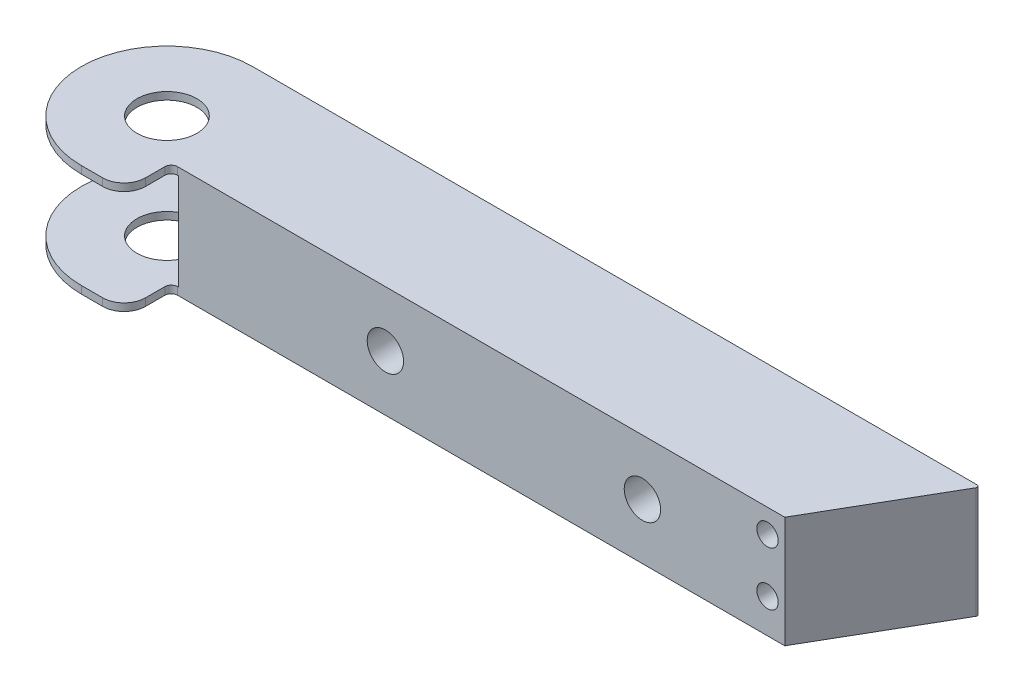
ISO-10303-21;
HEADER;
FILE_DESCRIPTION(('STEP AP214'),'2;1');
FILE_NAME('part.step','',(''),(''),'','','');
FILE_SCHEMA(('AUTOMOTIVE_DESIGN { 1 0 10303 214 1 1 1 1 }'));
ENDSEC;
DATA;
#1=APPLICATION_CONTEXT('core data for automotive mechanical design processes');
#2=APPLICATION_PROTOCOL_DEFINITION('international standard','automotive_design',2000,#1);
#3=PRODUCT_CONTEXT('',#1,'mechanical');
#4=PRODUCT('Part','Part','',(#3));
#5=PRODUCT_RELATED_PRODUCT_CATEGORY('part','',(#4));
#6=PRODUCT_DEFINITION_FORMATION('','',#4);
#7=PRODUCT_DEFINITION_CONTEXT('part definition',#1,'design');
#8=PRODUCT_DEFINITION('design','',#6,#7);
#9=PRODUCT_DEFINITION_SHAPE('','',#8);
#10=(LENGTH_UNIT() NAMED_UNIT(*) SI_UNIT(.MILLI.,.METRE.));
#11=(NAMED_UNIT(*) PLANE_ANGLE_UNIT() SI_UNIT($,.RADIAN.));
#12=(NAMED_UNIT(*) SI_UNIT($,.STERADIAN.) SOLID_ANGLE_UNIT());
#13=UNCERTAINTY_MEASURE_WITH_UNIT(LENGTH_MEASURE(1.E-05),#10,'distance_accuracy_value','');
#14=(GEOMETRIC_REPRESENTATION_CONTEXT(3) GLOBAL_UNCERTAINTY_ASSIGNED_CONTEXT((#13)) GLOBAL_UNIT_ASSIGNED_CONTEXT((#10,
#11,#12)) REPRESENTATION_CONTEXT('',''));
#15=CARTESIAN_POINT('',(0.,0.,0.));
#16=DIRECTION('',(0.,0.,1.));
#17=DIRECTION('',(1.,0.,0.));
#18=AXIS2_PLACEMENT_3D('',#15,#16,#17);
#19=CARTESIAN_POINT('',(4.,5.5,4.));
#20=DIRECTION('',(0.,-1.,0.));
#21=DIRECTION('',(0.,0.,-1.));
#22=AXIS2_PLACEMENT_3D('',#19,#20,#21);
#23=CYLINDRICAL_SURFACE('',#22,4.);
#24=DIRECTION('',(0.,-1.,0.));
#25=VECTOR('',#24,1.);
#26=CARTESIAN_POINT('',(4.,5.5,0.));
#27=LINE('',#26,#25);
#28=CARTESIAN_POINT('',(4.,5.,0.));
#29=VERTEX_POINT('',#28);
#30=CARTESIAN_POINT('',(4.,5.35,0.));
#31=VERTEX_POINT('',#30);
#32=EDGE_CURVE('E210',#29,#31,#27,.F.);
#33=ORIENTED_EDGE('',*,*,#32,.F.);
#34=CARTESIAN_POINT('',(4.,5.,4.));
#35=DIRECTION('',(0.,-1.,0.));
#36=DIRECTION('',(1.,0.,0.));
#37=AXIS2_PLACEMENT_3D('',#34,#35,#36);
#38=CIRCLE('',#37,4.);
#39=CARTESIAN_POINT('',(0.,5.,4.));
#40=VERTEX_POINT('',#39);
#41=EDGE_CURVE('E186',#29,#40,#38,.F.);
#42=ORIENTED_EDGE('',*,*,#41,.T.);
#43=DIRECTION('',(0.,-1.,0.));
#44=VECTOR('',#43,1.);
#45=CARTESIAN_POINT('',(0.,5.5,4.));
#46=LINE('',#45,#44);
#47=CARTESIAN_POINT('',(0.,5.35,4.));
#48=VERTEX_POINT('',#47);
#49=EDGE_CURVE('E219',#48,#40,#46,.T.);
#50=ORIENTED_EDGE('',*,*,#49,.F.);
#51=CARTESIAN_POINT('',(4.,5.35,4.));
#52=DIRECTION('',(0.,1.,0.));
#53=DIRECTION('',(0.,0.,1.));
#54=AXIS2_PLACEMENT_3D('',#51,#52,#53);
#55=CIRCLE('',#54,4.);
#56=EDGE_CURVE('E312',#48,#31,#55,.F.);
#57=ORIENTED_EDGE('',*,*,#56,.T.);
#58=EDGE_LOOP('',(#33,#42,#50,#57));
#59=FACE_BOUND('',#58,.T.);
#60=ADVANCED_FACE('F37',(#59),#23,.T.);
#61=CARTESIAN_POINT('',(4.,5.5,4.));
#62=DIRECTION('',(0.,-1.,0.));
#63=DIRECTION('',(0.,0.,-1.));
#64=AXIS2_PLACEMENT_3D('',#61,#62,#63);
#65=CYLINDRICAL_SURFACE('',#64,4.);
#66=ORIENTED_EDGE('',*,*,#49,.T.);
#67=CARTESIAN_POINT('',(4.,5.,4.));
#68=DIRECTION('',(0.,1.,0.));
#69=DIRECTION('',(-1.,0.,0.));
#70=AXIS2_PLACEMENT_3D('',#67,#68,#69);
#71=CIRCLE('',#70,4.);
#72=CARTESIAN_POINT('',(4.,5.,8.));
#73=VERTEX_POINT('',#72);
#74=EDGE_CURVE('E215',#73,#40,#71,.F.);
#75=ORIENTED_EDGE('',*,*,#74,.F.);
#76=DIRECTION('',(0.,-1.,0.));
#77=VECTOR('',#76,1.);
#78=CARTESIAN_POINT('',(4.,5.5,8.));
#79=LINE('',#78,#77);
#80=CARTESIAN_POINT('',(4.,5.35,8.));
#81=VERTEX_POINT('',#80);
#82=EDGE_CURVE('E372',#81,#73,#79,.T.);
#83=ORIENTED_EDGE('',*,*,#82,.F.);
#84=CARTESIAN_POINT('',(4.,5.35,4.));
#85=DIRECTION('',(0.,1.,0.));
#86=DIRECTION('',(0.,0.,1.));
#87=AXIS2_PLACEMENT_3D('',#84,#85,#86);
#88=CIRCLE('',#87,4.);
#89=EDGE_CURVE('E320',#81,#48,#88,.F.);
#90=ORIENTED_EDGE('',*,*,#89,.T.);
#91=EDGE_LOOP('',(#66,#75,#83,#90));
#92=FACE_BOUND('',#91,.T.);
#93=ADVANCED_FACE('F385',(#92),#65,.T.);
#94=CARTESIAN_POINT('',(4.,5.,4.));
#95=DIRECTION('',(0.,-1.,0.));
#96=DIRECTION('',(1.,0.,0.));
#97=AXIS2_PLACEMENT_3D('',#94,#95,#96);
#98=CYLINDRICAL_SURFACE('',#97,2.4);
#99=CARTESIAN_POINT('',(4.,5.,4.));
#100=DIRECTION('',(0.,1.,0.));
#101=DIRECTION('',(-1.,0.,0.));
#102=AXIS2_PLACEMENT_3D('',#99,#100,#101);
#103=CIRCLE('',#102,2.4);
#104=CARTESIAN_POINT('',(6.3473389188611,5.,4.5));
#105=VERTEX_POINT('',#104);
#106=CARTESIAN_POINT('',(4.,5.,1.6));
#107=VERTEX_POINT('',#106);
#108=EDGE_CURVE('E347',#105,#107,#103,.T.);
#109=ORIENTED_EDGE('',*,*,#108,.T.);
#110=DIRECTION('',(0.,-1.,0.));
#111=VECTOR('',#110,1.);
#112=CARTESIAN_POINT('',(4.,5.,1.6));
#113=LINE('',#112,#111);
#114=CARTESIAN_POINT('',(4.,0.5,1.6));
#115=VERTEX_POINT('',#114);
#116=EDGE_CURVE('E11',#107,#115,#113,.T.);
#117=ORIENTED_EDGE('',*,*,#116,.T.);
#118=CARTESIAN_POINT('',(4.,0.5,4.));
#119=DIRECTION('',(0.,1.,0.));
#120=DIRECTION('',(-1.,0.,0.));
#121=AXIS2_PLACEMENT_3D('',#118,#119,#120);
#122=CIRCLE('',#121,2.4);
#123=CARTESIAN_POINT('',(6.3473389188611,0.5,4.5));
#124=VERTEX_POINT('',#123);
#125=EDGE_CURVE('E196',#124,#115,#122,.T.);
#126=ORIENTED_EDGE('',*,*,#125,.F.);
#127=DIRECTION('',(0.,-1.,0.));
#128=VECTOR('',#127,1.);
#129=CARTESIAN_POINT('',(6.3473389188611,5.,4.5));
#130=LINE('',#129,#128);
#131=EDGE_CURVE('E350',#105,#124,#130,.T.);
#132=ORIENTED_EDGE('',*,*,#131,.F.);
#133=EDGE_LOOP('',(#109,#117,#126,#132));
#134=FACE_BOUND('',#133,.T.);
#135=ADVANCED_FACE('F446',(#134),#98,.F.);
#136=CARTESIAN_POINT('',(30.,5.5,8.));
#137=DIRECTION('',(0.,0.,-1.));
#138=DIRECTION('',(-1.,0.,0.));
#139=AXIS2_PLACEMENT_3D('',#136,#137,#138);
#140=PLANE('',#139);
#141=DIRECTION('',(1.,0.,0.));
#142=VECTOR('',#141,1.);
#143=CARTESIAN_POINT('',(30.,5.35,8.));
#144=LINE('',#143,#142);
#145=CARTESIAN_POINT('',(5.,5.35,8.));
#146=VERTEX_POINT('',#145);
#147=EDGE_CURVE('E323',#81,#146,#144,.T.);
#148=ORIENTED_EDGE('',*,*,#147,.F.);
#149=ORIENTED_EDGE('',*,*,#82,.T.);
#150=DIRECTION('',(-1.,0.,0.));
#151=VECTOR('',#150,1.);
#152=CARTESIAN_POINT('',(6.,5.,8.));
#153=LINE('',#152,#151);
#154=CARTESIAN_POINT('',(5.,5.,8.));
#155=VERTEX_POINT('',#154);
#156=EDGE_CURVE('E359',#155,#73,#153,.T.);
#157=ORIENTED_EDGE('',*,*,#156,.F.);
#158=DIRECTION('',(0.,-1.,0.));
#159=VECTOR('',#158,1.);
#160=CARTESIAN_POINT('',(5.,5.5,8.));
#161=LINE('',#160,#159);
#162=EDGE_CURVE('E247',#155,#146,#161,.F.);
#163=ORIENTED_EDGE('',*,*,#162,.T.);
#164=EDGE_LOOP('',(#148,#149,#157,#163));
#165=FACE_BOUND('',#164,.T.);
#166=ADVANCED_FACE('F389',(#165),#140,.F.);
#167=CARTESIAN_POINT('',(0.,5.5,0.));
#168=DIRECTION('',(0.,0.,1.));
#169=DIRECTION('',(1.,0.,0.));
#170=AXIS2_PLACEMENT_3D('',#167,#168,#169);
#171=PLANE('',#170);
#172=CARTESIAN_POINT('',(16.,2.75,0.));
#173=DIRECTION('',(0.,0.,-1.));
#174=DIRECTION('',(-1.,0.,0.));
#175=AXIS2_PLACEMENT_3D('',#172,#173,#174);
#176=CIRCLE('',#175,0.84999999999999);
#177=CARTESIAN_POINT('',(15.15,2.75,0.));
#178=VERTEX_POINT('',#177);
#179=EDGE_CURVE('E185',#178,#178,#176,.T.);
#180=ORIENTED_EDGE('',*,*,#179,.F.);
#181=EDGE_LOOP('',(#180));
#182=FACE_BOUND('',#181,.T.);
#183=CARTESIAN_POINT('',(28.,2.75,0.));
#184=DIRECTION('',(0.,0.,-1.));
#185=DIRECTION('',(-1.,0.,0.));
#186=AXIS2_PLACEMENT_3D('',#183,#184,#185);
#187=CIRCLE('',#186,0.849999999999986);
#188=CARTESIAN_POINT('',(27.15,2.75,0.));
#189=VERTEX_POINT('',#188);
#190=EDGE_CURVE('E266',#189,#189,#187,.T.);
#191=ORIENTED_EDGE('',*,*,#190,.F.);
#192=EDGE_LOOP('',(#191));
#193=FACE_BOUND('',#192,.T.);
#194=CARTESIAN_POINT('',(33.84,1.75,0.));
#195=DIRECTION('',(0.,0.,-1.));
#196=DIRECTION('',(-1.,0.,0.));
#197=AXIS2_PLACEMENT_3D('',#194,#195,#196);
#198=CIRCLE('',#197,0.499999999999999);
#199=CARTESIAN_POINT('',(33.34,1.75,0.));
#200=VERTEX_POINT('',#199);
#201=EDGE_CURVE('E328',#200,#200,#198,.T.);
#202=ORIENTED_EDGE('',*,*,#201,.F.);
#203=EDGE_LOOP('',(#202));
#204=FACE_BOUND('',#203,.T.);
#205=CARTESIAN_POINT('',(33.84,4.25,0.));
#206=DIRECTION('',(0.,0.,-1.));
#207=DIRECTION('',(-1.,0.,0.));
#208=AXIS2_PLACEMENT_3D('',#205,#206,#207);
#209=CIRCLE('',#208,0.499999999999999);
#210=CARTESIAN_POINT('',(33.34,4.25,0.));
#211=VERTEX_POINT('',#210);
#212=EDGE_CURVE('E255',#211,#211,#209,.T.);
#213=ORIENTED_EDGE('',*,*,#212,.F.);
#214=EDGE_LOOP('',(#213));
#215=FACE_BOUND('',#214,.T.);
#216=DIRECTION('',(0.,-1.,0.));
#217=VECTOR('',#216,1.);
#218=CARTESIAN_POINT('',(37.8266613534235,0.,0.));
#219=LINE('',#218,#217);
#220=CARTESIAN_POINT('',(37.8266613534235,5.35,0.));
#221=VERTEX_POINT('',#220);
#222=CARTESIAN_POINT('',(37.8266613534235,0.15,0.));
#223=VERTEX_POINT('',#222);
#224=EDGE_CURVE('E250',#221,#223,#219,.T.);
#225=ORIENTED_EDGE('',*,*,#224,.T.);
#226=DIRECTION('',(-1.,0.,0.));
#227=VECTOR('',#226,1.);
#228=CARTESIAN_POINT('',(0.,0.15,0.));
#229=LINE('',#228,#227);
#230=CARTESIAN_POINT('',(4.,0.15,0.));
#231=VERTEX_POINT('',#230);
#232=EDGE_CURVE('E208',#223,#231,#229,.T.);
#233=ORIENTED_EDGE('',*,*,#232,.T.);
#234=CARTESIAN_POINT('',(4.,0.5,0.));
#235=VERTEX_POINT('',#234);
#236=EDGE_CURVE('E202',#231,#235,#27,.F.);
#237=ORIENTED_EDGE('',*,*,#236,.T.);
#238=DIRECTION('',(0.,-1.,0.));
#239=VECTOR('',#238,1.);
#240=CARTESIAN_POINT('',(4.,5.5,0.));
#241=LINE('',#240,#239);
#242=EDGE_CURVE('E176',#235,#29,#241,.F.);
#243=ORIENTED_EDGE('',*,*,#242,.T.);
#244=ORIENTED_EDGE('',*,*,#32,.T.);
#245=DIRECTION('',(-1.,0.,0.));
#246=VECTOR('',#245,1.);
#247=CARTESIAN_POINT('',(0.,5.35,0.));
#248=LINE('',#247,#246);
#249=EDGE_CURVE('E307',#221,#31,#248,.T.);
#250=ORIENTED_EDGE('',*,*,#249,.F.);
#251=EDGE_LOOP('',(#225,#233,#237,#243,#244,#250));
#252=FACE_BOUND('',#251,.T.);
#253=ADVANCED_FACE('F207',(#182,#193,#204,#215,#252),#171,.F.);
#254=CARTESIAN_POINT('',(6.,5.5,4.5));
#255=DIRECTION('',(-1.,0.,0.));
#256=DIRECTION('',(0.,0.,1.));
#257=AXIS2_PLACEMENT_3D('',#254,#255,#256);
#258=PLANE('',#257);
#259=DIRECTION('',(0.,0.,-1.));
#260=VECTOR('',#259,1.);
#261=CARTESIAN_POINT('',(6.,5.35,4.5));
#262=LINE('',#261,#260);
#263=CARTESIAN_POINT('',(6.,5.35,7.));
#264=VERTEX_POINT('',#263);
#265=CARTESIAN_POINT('',(6.,5.35,6.1));
#266=VERTEX_POINT('',#265);
#267=EDGE_CURVE('E315',#264,#266,#262,.T.);
#268=ORIENTED_EDGE('',*,*,#267,.F.);
#269=DIRECTION('',(0.,-1.,0.));
#270=VECTOR('',#269,1.);
#271=CARTESIAN_POINT('',(6.,5.5,7.));
#272=LINE('',#271,#270);
#273=CARTESIAN_POINT('',(6.,5.,7.));
#274=VERTEX_POINT('',#273);
#275=EDGE_CURVE('E243',#264,#274,#272,.T.);
#276=ORIENTED_EDGE('',*,*,#275,.T.);
#277=DIRECTION('',(0.,0.,1.));
#278=VECTOR('',#277,1.);
#279=CARTESIAN_POINT('',(6.,5.,4.5));
#280=LINE('',#279,#278);
#281=CARTESIAN_POINT('',(6.,5.,6.1));
#282=VERTEX_POINT('',#281);
#283=EDGE_CURVE('E363',#282,#274,#280,.T.);
#284=ORIENTED_EDGE('',*,*,#283,.F.);
#285=DIRECTION('',(0.,-1.,0.));
#286=VECTOR('',#285,1.);
#287=CARTESIAN_POINT('',(6.,5.5,6.1));
#288=LINE('',#287,#286);
#289=EDGE_CURVE('E229',#282,#266,#288,.F.);
#290=ORIENTED_EDGE('',*,*,#289,.T.);
#291=EDGE_LOOP('',(#268,#276,#284,#290));
#292=FACE_BOUND('',#291,.T.);
#293=ADVANCED_FACE('F398',(#292),#258,.F.);
#294=CARTESIAN_POINT('',(4.,0.5,4.));
#295=DIRECTION('',(0.,-1.,0.));
#296=DIRECTION('',(1.,0.,0.));
#297=AXIS2_PLACEMENT_3D('',#294,#295,#296);
#298=CIRCLE('',#297,4.);
#299=CARTESIAN_POINT('',(0.,0.499999999999999,4.));
#300=VERTEX_POINT('',#299);
#301=EDGE_CURVE('E193',#235,#300,#298,.F.);
#302=ORIENTED_EDGE('',*,*,#301,.F.);
#303=ORIENTED_EDGE('',*,*,#236,.F.);
#304=CARTESIAN_POINT('',(4.,0.15,4.));
#305=DIRECTION('',(0.,1.,0.));
#306=DIRECTION('',(0.,0.,1.));
#307=AXIS2_PLACEMENT_3D('',#304,#305,#306);
#308=CIRCLE('',#307,4.);
#309=CARTESIAN_POINT('',(0.,0.15,4.));
#310=VERTEX_POINT('',#309);
#311=EDGE_CURVE('E287',#310,#231,#308,.F.);
#312=ORIENTED_EDGE('',*,*,#311,.F.);
#313=EDGE_CURVE('E203',#300,#310,#46,.T.);
#314=ORIENTED_EDGE('',*,*,#313,.F.);
#315=EDGE_LOOP('',(#302,#303,#312,#314));
#316=FACE_BOUND('',#315,.T.);
#317=ADVANCED_FACE('F200',(#316),#23,.T.);
#318=CARTESIAN_POINT('',(4.,0.5,4.));
#319=DIRECTION('',(0.,-1.,0.));
#320=DIRECTION('',(1.,0.,0.));
#321=AXIS2_PLACEMENT_3D('',#318,#319,#320);
#322=CIRCLE('',#321,4.);
#323=CARTESIAN_POINT('',(4.,0.5,8.));
#324=VERTEX_POINT('',#323);
#325=EDGE_CURVE('E371',#300,#324,#322,.F.);
#326=ORIENTED_EDGE('',*,*,#325,.F.);
#327=ORIENTED_EDGE('',*,*,#313,.T.);
#328=CARTESIAN_POINT('',(4.,0.15,4.));
#329=DIRECTION('',(0.,1.,0.));
#330=DIRECTION('',(0.,0.,1.));
#331=AXIS2_PLACEMENT_3D('',#328,#329,#330);
#332=CIRCLE('',#331,4.);
#333=CARTESIAN_POINT('',(4.,0.15,8.));
#334=VERTEX_POINT('',#333);
#335=EDGE_CURVE('E284',#334,#310,#332,.F.);
#336=ORIENTED_EDGE('',*,*,#335,.F.);
#337=DIRECTION('',(0.,-1.,0.));
#338=VECTOR('',#337,1.);
#339=CARTESIAN_POINT('',(4.,5.5,8.));
#340=LINE('',#339,#338);
#341=EDGE_CURVE('E366',#324,#334,#340,.T.);
#342=ORIENTED_EDGE('',*,*,#341,.F.);
#343=EDGE_LOOP('',(#326,#327,#336,#342));
#344=FACE_BOUND('',#343,.T.);
#345=ADVANCED_FACE('F422',(#344),#65,.T.);
#346=CARTESIAN_POINT('',(4.,-0.8,4.));
#347=DIRECTION('',(0.,1.,0.));
#348=DIRECTION('',(0.,0.,1.));
#349=AXIS2_PLACEMENT_3D('',#346,#347,#348);
#350=CYLINDRICAL_SURFACE('',#349,1.4);
#351=CARTESIAN_POINT('',(4.,5.,4.));
#352=DIRECTION('',(0.,1.,0.));
#353=DIRECTION('',(-1.,0.,0.));
#354=AXIS2_PLACEMENT_3D('',#351,#352,#353);
#355=CIRCLE('',#354,1.4);
#356=CARTESIAN_POINT('',(2.6,5.,4.));
#357=VERTEX_POINT('',#356);
#358=EDGE_CURVE('E354',#357,#357,#355,.T.);
#359=ORIENTED_EDGE('',*,*,#358,.F.);
#360=EDGE_LOOP('',(#359));
#361=FACE_BOUND('',#360,.T.);
#362=CARTESIAN_POINT('',(4.,5.35,4.));
#363=DIRECTION('',(0.,1.,0.));
#364=DIRECTION('',(0.,0.,1.));
#365=AXIS2_PLACEMENT_3D('',#362,#363,#364);
#366=CIRCLE('',#365,1.4);
#367=CARTESIAN_POINT('',(4.,5.35,5.4));
#368=VERTEX_POINT('',#367);
#369=EDGE_CURVE('E325',#368,#368,#366,.F.);
#370=ORIENTED_EDGE('',*,*,#369,.F.);
#371=EDGE_LOOP('',(#370));
#372=FACE_BOUND('',#371,.T.);
#373=ADVANCED_FACE('F468',(#361,#372),#350,.F.);
#374=CARTESIAN_POINT('',(0.,0.,5.8));
#375=DIRECTION('',(0.,0.,1.));
#376=DIRECTION('',(1.,0.,0.));
#377=AXIS2_PLACEMENT_3D('',#374,#375,#376);
#378=PLANE('',#377);
#379=CARTESIAN_POINT('',(16.,2.75,5.8));
#380=DIRECTION('',(0.,0.,1.));
#381=DIRECTION('',(1.,0.,0.));
#382=AXIS2_PLACEMENT_3D('',#379,#380,#381);
#383=CIRCLE('',#382,0.849999999999988);
#384=CARTESIAN_POINT('',(16.85,2.75,5.8));
#385=VERTEX_POINT('',#384);
#386=EDGE_CURVE('E264',#385,#385,#383,.T.);
#387=ORIENTED_EDGE('',*,*,#386,.F.);
#388=EDGE_LOOP('',(#387));
#389=FACE_BOUND('',#388,.T.);
#390=CARTESIAN_POINT('',(28.,2.75,5.8));
#391=DIRECTION('',(0.,0.,1.));
#392=DIRECTION('',(1.,0.,0.));
#393=AXIS2_PLACEMENT_3D('',#390,#391,#392);
#394=CIRCLE('',#393,0.849999999999986);
#395=CARTESIAN_POINT('',(28.85,2.75,5.8));
#396=VERTEX_POINT('',#395);
#397=EDGE_CURVE('E270',#396,#396,#394,.T.);
#398=ORIENTED_EDGE('',*,*,#397,.F.);
#399=EDGE_LOOP('',(#398));
#400=FACE_BOUND('',#399,.T.);
#401=DIRECTION('',(-1.,0.,0.));
#402=VECTOR('',#401,1.);
#403=CARTESIAN_POINT('',(0.,0.15,5.8));
#404=LINE('',#403,#402);
#405=CARTESIAN_POINT('',(34.6462048885579,0.15,5.8));
#406=VERTEX_POINT('',#405);
#407=CARTESIAN_POINT('',(6.3,0.15,5.8));
#408=VERTEX_POINT('',#407);
#409=EDGE_CURVE('E297',#406,#408,#404,.T.);
#410=ORIENTED_EDGE('',*,*,#409,.F.);
#411=DIRECTION('',(0.,1.,0.));
#412=VECTOR('',#411,1.);
#413=CARTESIAN_POINT('',(34.6462048885579,0.,5.8));
#414=LINE('',#413,#412);
#415=CARTESIAN_POINT('',(34.6462048885579,5.35,5.8));
#416=VERTEX_POINT('',#415);
#417=EDGE_CURVE('E258',#406,#416,#414,.T.);
#418=ORIENTED_EDGE('',*,*,#417,.T.);
#419=DIRECTION('',(-1.,0.,0.));
#420=VECTOR('',#419,1.);
#421=CARTESIAN_POINT('',(0.,5.35,5.8));
#422=LINE('',#421,#420);
#423=CARTESIAN_POINT('',(6.3,5.35,5.8));
#424=VERTEX_POINT('',#423);
#425=EDGE_CURVE('E304',#416,#424,#422,.T.);
#426=ORIENTED_EDGE('',*,*,#425,.T.);
#427=DIRECTION('',(0.,-1.,0.));
#428=VECTOR('',#427,1.);
#429=CARTESIAN_POINT('',(6.3,0.,5.8));
#430=LINE('',#429,#428);
#431=CARTESIAN_POINT('',(6.3,5.,5.8));
#432=VERTEX_POINT('',#431);
#433=EDGE_CURVE('E213',#424,#432,#430,.T.);
#434=ORIENTED_EDGE('',*,*,#433,.T.);
#435=DIRECTION('',(1.,0.,0.));
#436=VECTOR('',#435,1.);
#437=CARTESIAN_POINT('',(6.3473389188611,5.,5.8));
#438=LINE('',#437,#436);
#439=CARTESIAN_POINT('',(6.3473389188611,5.,5.8));
#440=VERTEX_POINT('',#439);
#441=EDGE_CURVE('E340',#432,#440,#438,.T.);
#442=ORIENTED_EDGE('',*,*,#441,.T.);
#443=DIRECTION('',(0.,-1.,0.));
#444=VECTOR('',#443,1.);
#445=CARTESIAN_POINT('',(6.3473389188611,0.5,5.8));
#446=LINE('',#445,#444);
#447=CARTESIAN_POINT('',(6.3473389188611,0.5,5.8));
#448=VERTEX_POINT('',#447);
#449=EDGE_CURVE('E334',#440,#448,#446,.T.);
#450=ORIENTED_EDGE('',*,*,#449,.T.);
#451=DIRECTION('',(-1.,0.,0.));
#452=VECTOR('',#451,1.);
#453=CARTESIAN_POINT('',(6.,0.5,5.8));
#454=LINE('',#453,#452);
#455=CARTESIAN_POINT('',(6.3,0.5,5.8));
#456=VERTEX_POINT('',#455);
#457=EDGE_CURVE('E337',#448,#456,#454,.T.);
#458=ORIENTED_EDGE('',*,*,#457,.T.);
#459=DIRECTION('',(0.,-1.,0.));
#460=VECTOR('',#459,1.);
#461=CARTESIAN_POINT('',(6.3,0.,5.8));
#462=LINE('',#461,#460);
#463=EDGE_CURVE('E224',#456,#408,#462,.T.);
#464=ORIENTED_EDGE('',*,*,#463,.T.);
#465=EDGE_LOOP('',(#410,#418,#426,#434,#442,#450,#458,#464));
#466=FACE_BOUND('',#465,.T.);
#467=CARTESIAN_POINT('',(33.84,4.25,5.8));
#468=DIRECTION('',(0.,0.,1.));
#469=DIRECTION('',(1.,0.,0.));
#470=AXIS2_PLACEMENT_3D('',#467,#468,#469);
#471=CIRCLE('',#470,0.499999999999999);
#472=CARTESIAN_POINT('',(34.34,4.25,5.8));
#473=VERTEX_POINT('',#472);
#474=EDGE_CURVE('E254',#473,#473,#471,.T.);
#475=ORIENTED_EDGE('',*,*,#474,.F.);
#476=EDGE_LOOP('',(#475));
#477=FACE_BOUND('',#476,.T.);
#478=CARTESIAN_POINT('',(33.84,1.75,5.8));
#479=DIRECTION('',(0.,0.,1.));
#480=DIRECTION('',(1.,0.,0.));
#481=AXIS2_PLACEMENT_3D('',#478,#479,#480);
#482=CIRCLE('',#481,0.499999999999999);
#483=CARTESIAN_POINT('',(34.34,1.75,5.8));
#484=VERTEX_POINT('',#483);
#485=EDGE_CURVE('E251',#484,#484,#482,.T.);
#486=ORIENTED_EDGE('',*,*,#485,.F.);
#487=EDGE_LOOP('',(#486));
#488=FACE_BOUND('',#487,.T.);
#489=ADVANCED_FACE('F409',(#389,#400,#466,#477,#488),#378,.T.);
#490=CARTESIAN_POINT('',(6.3,0.,6.1));
#491=DIRECTION('',(0.,-1.,0.));
#492=DIRECTION('',(0.,0.,-1.));
#493=AXIS2_PLACEMENT_3D('',#490,#491,#492);
#494=CYLINDRICAL_SURFACE('',#493,0.3);
#495=CARTESIAN_POINT('',(6.3,5.35,6.1));
#496=DIRECTION('',(0.,1.,0.));
#497=DIRECTION('',(0.,0.,1.));
#498=AXIS2_PLACEMENT_3D('',#495,#496,#497);
#499=CIRCLE('',#498,0.3);
#500=EDGE_CURVE('E310',#266,#424,#499,.F.);
#501=ORIENTED_EDGE('',*,*,#500,.F.);
#502=ORIENTED_EDGE('',*,*,#289,.F.);
#503=CARTESIAN_POINT('',(6.3,5.,6.1));
#504=DIRECTION('',(0.,1.,0.));
#505=DIRECTION('',(-1.,0.,0.));
#506=AXIS2_PLACEMENT_3D('',#503,#504,#505);
#507=CIRCLE('',#506,0.3);
#508=EDGE_CURVE('E234',#432,#282,#507,.T.);
#509=ORIENTED_EDGE('',*,*,#508,.F.);
#510=ORIENTED_EDGE('',*,*,#433,.F.);
#511=EDGE_LOOP('',(#501,#502,#509,#510));
#512=FACE_BOUND('',#511,.T.);
#513=ADVANCED_FACE('F403',(#512),#494,.F.);
#514=CARTESIAN_POINT('',(5.,5.5,7.));
#515=DIRECTION('',(0.,-1.,0.));
#516=DIRECTION('',(0.,0.,-1.));
#517=AXIS2_PLACEMENT_3D('',#514,#515,#516);
#518=CYLINDRICAL_SURFACE('',#517,1.);
#519=ORIENTED_EDGE('',*,*,#275,.F.);
#520=CARTESIAN_POINT('',(5.,5.35,7.));
#521=DIRECTION('',(0.,1.,0.));
#522=DIRECTION('',(0.,0.,1.));
#523=AXIS2_PLACEMENT_3D('',#520,#521,#522);
#524=CIRCLE('',#523,1.);
#525=EDGE_CURVE('E317',#264,#146,#524,.F.);
#526=ORIENTED_EDGE('',*,*,#525,.T.);
#527=ORIENTED_EDGE('',*,*,#162,.F.);
#528=CARTESIAN_POINT('',(5.,5.,7.));
#529=DIRECTION('',(0.,1.,0.));
#530=DIRECTION('',(-1.,0.,0.));
#531=AXIS2_PLACEMENT_3D('',#528,#529,#530);
#532=CIRCLE('',#531,1.);
#533=EDGE_CURVE('E245',#274,#155,#532,.F.);
#534=ORIENTED_EDGE('',*,*,#533,.F.);
#535=EDGE_LOOP('',(#519,#526,#527,#534));
#536=FACE_BOUND('',#535,.T.);
#537=ADVANCED_FACE('F394',(#536),#518,.T.);
#538=CARTESIAN_POINT('',(34.6462048885579,0.,5.8));
#539=DIRECTION('',(0.865691489384143,0.,0.500577911226478));
#540=DIRECTION('',(0.500577911226478,0.,-0.865691489384143));
#541=AXIS2_PLACEMENT_3D('',#538,#539,#540);
#542=PLANE('',#541);
#543=DIRECTION('',(-0.500577911226478,0.,0.865691489384143));
#544=VECTOR('',#543,1.);
#545=CARTESIAN_POINT('',(34.6462048885579,0.15,5.8));
#546=LINE('',#545,#544);
#547=CARTESIAN_POINT('',(37.9132305023619,0.15,0.150057791122646));
#548=VERTEX_POINT('',#547);
#549=EDGE_CURVE('E295',#548,#406,#546,.T.);
#550=ORIENTED_EDGE('',*,*,#549,.F.);
#551=DIRECTION('',(0.,-1.,0.));
#552=VECTOR('',#551,1.);
#553=CARTESIAN_POINT('',(37.9132305023619,5.5,0.150057791122649));
#554=LINE('',#553,#552);
#555=CARTESIAN_POINT('',(37.9132305023619,5.35,0.150057791122649));
#556=VERTEX_POINT('',#555);
#557=EDGE_CURVE('E60',#548,#556,#554,.F.);
#558=ORIENTED_EDGE('',*,*,#557,.T.);
#559=DIRECTION('',(-0.500577911226478,0.,0.865691489384143));
#560=VECTOR('',#559,1.);
#561=CARTESIAN_POINT('',(34.6462048885579,5.35,5.8));
#562=LINE('',#561,#560);
#563=EDGE_CURVE('E302',#556,#416,#562,.T.);
#564=ORIENTED_EDGE('',*,*,#563,.T.);
#565=ORIENTED_EDGE('',*,*,#417,.F.);
#566=EDGE_LOOP('',(#550,#558,#564,#565));
#567=FACE_BOUND('',#566,.T.);
#568=ADVANCED_FACE('F412',(#567),#542,.T.);
#569=CARTESIAN_POINT('',(37.8266613534235,5.5,0.1));
#570=DIRECTION('',(0.,1.,0.));
#571=DIRECTION('',(0.,0.,1.));
#572=AXIS2_PLACEMENT_3D('',#569,#570,#571);
#573=CYLINDRICAL_SURFACE('',#572,0.1);
#574=CARTESIAN_POINT('',(37.8266613534235,0.15,0.1));
#575=DIRECTION('',(0.,1.,0.));
#576=DIRECTION('',(0.,0.,1.));
#577=AXIS2_PLACEMENT_3D('',#574,#575,#576);
#578=CIRCLE('',#577,0.1);
#579=EDGE_CURVE('E293',#223,#548,#578,.F.);
#580=ORIENTED_EDGE('',*,*,#579,.F.);
#581=ORIENTED_EDGE('',*,*,#224,.F.);
#582=CARTESIAN_POINT('',(37.8266613534235,5.35,0.1));
#583=DIRECTION('',(0.,1.,0.));
#584=DIRECTION('',(0.,0.,1.));
#585=AXIS2_PLACEMENT_3D('',#582,#583,#584);
#586=CIRCLE('',#585,0.1);
#587=EDGE_CURVE('E261',#221,#556,#586,.F.);
#588=ORIENTED_EDGE('',*,*,#587,.T.);
#589=ORIENTED_EDGE('',*,*,#557,.F.);
#590=EDGE_LOOP('',(#580,#581,#588,#589));
#591=FACE_BOUND('',#590,.T.);
#592=ADVANCED_FACE('F39',(#591),#573,.T.);
#593=CARTESIAN_POINT('',(4.,0.15,4.));
#594=DIRECTION('',(0.,1.,0.));
#595=DIRECTION('',(0.,0.,1.));
#596=AXIS2_PLACEMENT_3D('',#593,#594,#595);
#597=CIRCLE('',#596,1.4);
#598=CARTESIAN_POINT('',(4.,0.15,5.4));
#599=VERTEX_POINT('',#598);
#600=EDGE_CURVE('E299',#599,#599,#597,.F.);
#601=ORIENTED_EDGE('',*,*,#600,.T.);
#602=EDGE_LOOP('',(#601));
#603=FACE_BOUND('',#602,.T.);
#604=CARTESIAN_POINT('',(4.,0.5,4.));
#605=DIRECTION('',(0.,-1.,0.));
#606=DIRECTION('',(1.,0.,0.));
#607=AXIS2_PLACEMENT_3D('',#604,#605,#606);
#608=CIRCLE('',#607,1.4);
#609=CARTESIAN_POINT('',(5.4,0.5,4.));
#610=VERTEX_POINT('',#609);
#611=EDGE_CURVE('E209',#610,#610,#608,.T.);
#612=ORIENTED_EDGE('',*,*,#611,.F.);
#613=EDGE_LOOP('',(#612));
#614=FACE_BOUND('',#613,.T.);
#615=ADVANCED_FACE('F482',(#603,#614),#350,.F.);
#616=ORIENTED_EDGE('',*,*,#341,.T.);
#617=DIRECTION('',(1.,0.,0.));
#618=VECTOR('',#617,1.);
#619=CARTESIAN_POINT('',(30.,0.15,8.));
#620=LINE('',#619,#618);
#621=CARTESIAN_POINT('',(5.,0.15,8.));
#622=VERTEX_POINT('',#621);
#623=EDGE_CURVE('E281',#334,#622,#620,.T.);
#624=ORIENTED_EDGE('',*,*,#623,.T.);
#625=DIRECTION('',(0.,-1.,0.));
#626=VECTOR('',#625,1.);
#627=CARTESIAN_POINT('',(5.,5.5,8.));
#628=LINE('',#627,#626);
#629=CARTESIAN_POINT('',(5.,0.5,8.));
#630=VERTEX_POINT('',#629);
#631=EDGE_CURVE('E239',#622,#630,#628,.F.);
#632=ORIENTED_EDGE('',*,*,#631,.T.);
#633=DIRECTION('',(1.,0.,0.));
#634=VECTOR('',#633,1.);
#635=CARTESIAN_POINT('',(0.,0.5,8.));
#636=LINE('',#635,#634);
#637=EDGE_CURVE('E221',#324,#630,#636,.T.);
#638=ORIENTED_EDGE('',*,*,#637,.F.);
#639=EDGE_LOOP('',(#616,#624,#632,#638));
#640=FACE_BOUND('',#639,.T.);
#641=ADVANCED_FACE('F425',(#640),#140,.F.);
#642=CARTESIAN_POINT('',(6.,5.,4.5));
#643=DIRECTION('',(0.,1.,0.));
#644=DIRECTION('',(-1.,0.,0.));
#645=AXIS2_PLACEMENT_3D('',#642,#643,#644);
#646=PLANE('',#645);
#647=ORIENTED_EDGE('',*,*,#74,.T.);
#648=ORIENTED_EDGE('',*,*,#41,.F.);
#649=DIRECTION('',(0.,0.,1.));
#650=VECTOR('',#649,1.);
#651=CARTESIAN_POINT('',(4.,5.,-0.442176813787228));
#652=LINE('',#651,#650);
#653=EDGE_CURVE('E181',#29,#107,#652,.T.);
#654=ORIENTED_EDGE('',*,*,#653,.T.);
#655=ORIENTED_EDGE('',*,*,#108,.F.);
#656=DIRECTION('',(0.,0.,-1.));
#657=VECTOR('',#656,1.);
#658=CARTESIAN_POINT('',(6.3473389188611,5.,5.8));
#659=LINE('',#658,#657);
#660=EDGE_CURVE('E342',#440,#105,#659,.T.);
#661=ORIENTED_EDGE('',*,*,#660,.F.);
#662=ORIENTED_EDGE('',*,*,#441,.F.);
#663=ORIENTED_EDGE('',*,*,#508,.T.);
#664=ORIENTED_EDGE('',*,*,#283,.T.);
#665=ORIENTED_EDGE('',*,*,#533,.T.);
#666=ORIENTED_EDGE('',*,*,#156,.T.);
#667=EDGE_LOOP('',(#647,#648,#654,#655,#661,#662,#663,#664,#665,#666));
#668=FACE_BOUND('',#667,.T.);
#669=ORIENTED_EDGE('',*,*,#358,.T.);
#670=EDGE_LOOP('',(#669));
#671=FACE_BOUND('',#670,.T.);
#672=ADVANCED_FACE('F380',(#668,#671),#646,.F.);
#673=CARTESIAN_POINT('',(6.,0.5,4.5));
#674=DIRECTION('',(-1.,0.,0.));
#675=DIRECTION('',(0.,0.,1.));
#676=AXIS2_PLACEMENT_3D('',#673,#674,#675);
#677=PLANE('',#676);
#678=DIRECTION('',(0.,-1.,0.));
#679=VECTOR('',#678,1.);
#680=CARTESIAN_POINT('',(6.,0.5,7.));
#681=LINE('',#680,#679);
#682=CARTESIAN_POINT('',(6.,0.5,7.));
#683=VERTEX_POINT('',#682);
#684=CARTESIAN_POINT('',(6.,0.15,7.));
#685=VERTEX_POINT('',#684);
#686=EDGE_CURVE('E236',#683,#685,#681,.T.);
#687=ORIENTED_EDGE('',*,*,#686,.T.);
#688=DIRECTION('',(0.,0.,-1.));
#689=VECTOR('',#688,1.);
#690=CARTESIAN_POINT('',(6.,0.15,4.5));
#691=LINE('',#690,#689);
#692=CARTESIAN_POINT('',(6.,0.15,6.1));
#693=VERTEX_POINT('',#692);
#694=EDGE_CURVE('E52',#685,#693,#691,.T.);
#695=ORIENTED_EDGE('',*,*,#694,.T.);
#696=DIRECTION('',(0.,-1.,0.));
#697=VECTOR('',#696,1.);
#698=CARTESIAN_POINT('',(6.,0.5,6.1));
#699=LINE('',#698,#697);
#700=CARTESIAN_POINT('',(6.,0.5,6.1));
#701=VERTEX_POINT('',#700);
#702=EDGE_CURVE('E227',#693,#701,#699,.F.);
#703=ORIENTED_EDGE('',*,*,#702,.T.);
#704=DIRECTION('',(0.,0.,1.));
#705=VECTOR('',#704,1.);
#706=CARTESIAN_POINT('',(6.,0.5,4.5));
#707=LINE('',#706,#705);
#708=EDGE_CURVE('E362',#701,#683,#707,.T.);
#709=ORIENTED_EDGE('',*,*,#708,.T.);
#710=EDGE_LOOP('',(#687,#695,#703,#709));
#711=FACE_BOUND('',#710,.T.);
#712=ADVANCED_FACE('F433',(#711),#677,.F.);
#713=CARTESIAN_POINT('',(0.,0.5,4.5));
#714=DIRECTION('',(0.,-1.,0.));
#715=DIRECTION('',(1.,0.,0.));
#716=AXIS2_PLACEMENT_3D('',#713,#714,#715);
#717=PLANE('',#716);
#718=ORIENTED_EDGE('',*,*,#611,.T.);
#719=EDGE_LOOP('',(#718));
#720=FACE_BOUND('',#719,.T.);
#721=ORIENTED_EDGE('',*,*,#325,.T.);
#722=ORIENTED_EDGE('',*,*,#637,.T.);
#723=CARTESIAN_POINT('',(5.,0.5,7.));
#724=DIRECTION('',(0.,-1.,0.));
#725=DIRECTION('',(1.,0.,0.));
#726=AXIS2_PLACEMENT_3D('',#723,#724,#725);
#727=CIRCLE('',#726,1.);
#728=EDGE_CURVE('E241',#630,#683,#727,.F.);
#729=ORIENTED_EDGE('',*,*,#728,.T.);
#730=ORIENTED_EDGE('',*,*,#708,.F.);
#731=CARTESIAN_POINT('',(6.3,0.5,6.1));
#732=DIRECTION('',(0.,-1.,0.));
#733=DIRECTION('',(1.,0.,0.));
#734=AXIS2_PLACEMENT_3D('',#731,#732,#733);
#735=CIRCLE('',#734,0.3);
#736=EDGE_CURVE('E232',#701,#456,#735,.T.);
#737=ORIENTED_EDGE('',*,*,#736,.T.);
#738=ORIENTED_EDGE('',*,*,#457,.F.);
#739=DIRECTION('',(0.,0.,-1.));
#740=VECTOR('',#739,1.);
#741=CARTESIAN_POINT('',(6.3473389188611,0.5,5.8));
#742=LINE('',#741,#740);
#743=EDGE_CURVE('E345',#448,#124,#742,.T.);
#744=ORIENTED_EDGE('',*,*,#743,.T.);
#745=ORIENTED_EDGE('',*,*,#125,.T.);
#746=DIRECTION('',(0.,0.,1.));
#747=VECTOR('',#746,1.);
#748=CARTESIAN_POINT('',(4.,0.5,-0.442176813787228));
#749=LINE('',#748,#747);
#750=EDGE_CURVE('E179',#235,#115,#749,.T.);
#751=ORIENTED_EDGE('',*,*,#750,.F.);
#752=ORIENTED_EDGE('',*,*,#301,.T.);
#753=EDGE_LOOP('',(#721,#722,#729,#730,#737,#738,#744,#745,#751,#752));
#754=FACE_BOUND('',#753,.T.);
#755=ADVANCED_FACE('F192',(#720,#754),#717,.F.);
#756=CARTESIAN_POINT('',(6.3473389188611,0.5,5.8));
#757=DIRECTION('',(1.,0.,0.));
#758=DIRECTION('',(0.,0.,-1.));
#759=AXIS2_PLACEMENT_3D('',#756,#757,#758);
#760=PLANE('',#759);
#761=ORIENTED_EDGE('',*,*,#131,.T.);
#762=ORIENTED_EDGE('',*,*,#743,.F.);
#763=ORIENTED_EDGE('',*,*,#449,.F.);
#764=ORIENTED_EDGE('',*,*,#660,.T.);
#765=EDGE_LOOP('',(#761,#762,#763,#764));
#766=FACE_BOUND('',#765,.T.);
#767=ADVANCED_FACE('F442',(#766),#760,.F.);
#768=CARTESIAN_POINT('',(6.3,0.,6.1));
#769=DIRECTION('',(0.,-1.,0.));
#770=DIRECTION('',(0.,0.,-1.));
#771=AXIS2_PLACEMENT_3D('',#768,#769,#770);
#772=CYLINDRICAL_SURFACE('',#771,0.3);
#773=ORIENTED_EDGE('',*,*,#702,.F.);
#774=CARTESIAN_POINT('',(6.3,0.15,6.1));
#775=DIRECTION('',(0.,1.,0.));
#776=DIRECTION('',(0.,0.,1.));
#777=AXIS2_PLACEMENT_3D('',#774,#775,#776);
#778=CIRCLE('',#777,0.3);
#779=EDGE_CURVE('E290',#693,#408,#778,.F.);
#780=ORIENTED_EDGE('',*,*,#779,.T.);
#781=ORIENTED_EDGE('',*,*,#463,.F.);
#782=ORIENTED_EDGE('',*,*,#736,.F.);
#783=EDGE_LOOP('',(#773,#780,#781,#782));
#784=FACE_BOUND('',#783,.T.);
#785=ADVANCED_FACE('F438',(#784),#772,.F.);
#786=CARTESIAN_POINT('',(5.,0.5,7.));
#787=DIRECTION('',(0.,-1.,0.));
#788=DIRECTION('',(0.,0.,-1.));
#789=AXIS2_PLACEMENT_3D('',#786,#787,#788);
#790=CYLINDRICAL_SURFACE('',#789,1.);
#791=CARTESIAN_POINT('',(5.,0.15,7.));
#792=DIRECTION('',(0.,1.,0.));
#793=DIRECTION('',(0.,0.,1.));
#794=AXIS2_PLACEMENT_3D('',#791,#792,#793);
#795=CIRCLE('',#794,1.);
#796=EDGE_CURVE('E45',#685,#622,#795,.F.);
#797=ORIENTED_EDGE('',*,*,#796,.F.);
#798=ORIENTED_EDGE('',*,*,#686,.F.);
#799=ORIENTED_EDGE('',*,*,#728,.F.);
#800=ORIENTED_EDGE('',*,*,#631,.F.);
#801=EDGE_LOOP('',(#797,#798,#799,#800));
#802=FACE_BOUND('',#801,.T.);
#803=ADVANCED_FACE('F431',(#802),#790,.T.);
#804=CARTESIAN_POINT('',(33.84,1.75,6.5));
#805=DIRECTION('',(0.,0.,-1.));
#806=DIRECTION('',(-1.,0.,0.));
#807=AXIS2_PLACEMENT_3D('',#804,#805,#806);
#808=CYLINDRICAL_SURFACE('',#807,0.499999999999999);
#809=ORIENTED_EDGE('',*,*,#485,.T.);
#810=EDGE_LOOP('',(#809));
#811=FACE_BOUND('',#810,.T.);
#812=ORIENTED_EDGE('',*,*,#201,.T.);
#813=EDGE_LOOP('',(#812));
#814=FACE_BOUND('',#813,.T.);
#815=ADVANCED_FACE('F511',(#811,#814),#808,.F.);
#816=CARTESIAN_POINT('',(33.84,4.25,6.5));
#817=DIRECTION('',(0.,0.,-1.));
#818=DIRECTION('',(-1.,0.,0.));
#819=AXIS2_PLACEMENT_3D('',#816,#817,#818);
#820=CYLINDRICAL_SURFACE('',#819,0.499999999999999);
#821=ORIENTED_EDGE('',*,*,#474,.T.);
#822=EDGE_LOOP('',(#821));
#823=FACE_BOUND('',#822,.T.);
#824=ORIENTED_EDGE('',*,*,#212,.T.);
#825=EDGE_LOOP('',(#824));
#826=FACE_BOUND('',#825,.T.);
#827=ADVANCED_FACE('F503',(#823,#826),#820,.F.);
#828=CARTESIAN_POINT('',(0.,5.35,0.));
#829=DIRECTION('',(0.,1.,0.));
#830=DIRECTION('',(0.,0.,1.));
#831=AXIS2_PLACEMENT_3D('',#828,#829,#830);
#832=PLANE('',#831);
#833=ORIENTED_EDGE('',*,*,#147,.T.);
#834=ORIENTED_EDGE('',*,*,#525,.F.);
#835=ORIENTED_EDGE('',*,*,#267,.T.);
#836=ORIENTED_EDGE('',*,*,#500,.T.);
#837=ORIENTED_EDGE('',*,*,#425,.F.);
#838=ORIENTED_EDGE('',*,*,#563,.F.);
#839=ORIENTED_EDGE('',*,*,#587,.F.);
#840=ORIENTED_EDGE('',*,*,#249,.T.);
#841=ORIENTED_EDGE('',*,*,#56,.F.);
#842=ORIENTED_EDGE('',*,*,#89,.F.);
#843=EDGE_LOOP('',(#833,#834,#835,#836,#837,#838,#839,#840,#841,#842));
#844=FACE_BOUND('',#843,.T.);
#845=ORIENTED_EDGE('',*,*,#369,.T.);
#846=EDGE_LOOP('',(#845));
#847=FACE_BOUND('',#846,.T.);
#848=ADVANCED_FACE('F387',(#844,#847),#832,.T.);
#849=CARTESIAN_POINT('',(0.,0.15,0.));
#850=DIRECTION('',(0.,1.,0.));
#851=DIRECTION('',(0.,0.,1.));
#852=AXIS2_PLACEMENT_3D('',#849,#850,#851);
#853=PLANE('',#852);
#854=ORIENTED_EDGE('',*,*,#409,.T.);
#855=ORIENTED_EDGE('',*,*,#779,.F.);
#856=ORIENTED_EDGE('',*,*,#694,.F.);
#857=ORIENTED_EDGE('',*,*,#796,.T.);
#858=ORIENTED_EDGE('',*,*,#623,.F.);
#859=ORIENTED_EDGE('',*,*,#335,.T.);
#860=ORIENTED_EDGE('',*,*,#311,.T.);
#861=ORIENTED_EDGE('',*,*,#232,.F.);
#862=ORIENTED_EDGE('',*,*,#579,.T.);
#863=ORIENTED_EDGE('',*,*,#549,.T.);
#864=EDGE_LOOP('',(#854,#855,#856,#857,#858,#859,#860,#861,#862,#863));
#865=FACE_BOUND('',#864,.T.);
#866=ORIENTED_EDGE('',*,*,#600,.F.);
#867=EDGE_LOOP('',(#866));
#868=FACE_BOUND('',#867,.T.);
#869=ADVANCED_FACE('F417',(#865,#868),#853,.F.);
#870=CARTESIAN_POINT('',(28.,2.75,0.));
#871=DIRECTION('',(0.,0.,-1.));
#872=DIRECTION('',(-1.,0.,0.));
#873=AXIS2_PLACEMENT_3D('',#870,#871,#872);
#874=CYLINDRICAL_SURFACE('',#873,0.849999999999986);
#875=ORIENTED_EDGE('',*,*,#397,.T.);
#876=EDGE_LOOP('',(#875));
#877=FACE_BOUND('',#876,.T.);
#878=ORIENTED_EDGE('',*,*,#190,.T.);
#879=EDGE_LOOP('',(#878));
#880=FACE_BOUND('',#879,.T.);
#881=ADVANCED_FACE('F509',(#877,#880),#874,.F.);
#882=CARTESIAN_POINT('',(16.,2.75,0.));
#883=DIRECTION('',(0.,0.,-1.));
#884=DIRECTION('',(-1.,0.,0.));
#885=AXIS2_PLACEMENT_3D('',#882,#883,#884);
#886=CYLINDRICAL_SURFACE('',#885,0.849999999999988);
#887=ORIENTED_EDGE('',*,*,#386,.T.);
#888=EDGE_LOOP('',(#887));
#889=FACE_BOUND('',#888,.T.);
#890=ORIENTED_EDGE('',*,*,#179,.T.);
#891=EDGE_LOOP('',(#890));
#892=FACE_BOUND('',#891,.T.);
#893=ADVANCED_FACE('F592',(#889,#892),#886,.F.);
#894=CARTESIAN_POINT('',(4.,-9.43300932370166,-0.442176813787228));
#895=DIRECTION('',(-1.,0.,0.));
#896=DIRECTION('',(0.,-1.,0.));
#897=AXIS2_PLACEMENT_3D('',#894,#895,#896);
#898=PLANE('',#897);
#899=ORIENTED_EDGE('',*,*,#750,.T.);
#900=ORIENTED_EDGE('',*,*,#116,.F.);
#901=ORIENTED_EDGE('',*,*,#653,.F.);
#902=ORIENTED_EDGE('',*,*,#242,.F.);
#903=EDGE_LOOP('',(#899,#900,#901,#902));
#904=FACE_BOUND('',#903,.T.);
#905=ADVANCED_FACE('F178',(#904),#898,.T.);
#906=CLOSED_SHELL('',(#60,#93,#135,#166,#253,#293,#317,#345,#373,#489,#513,#537,#568,#592,#615,
#641,#672,#712,#755,#767,#785,#803,#815,#827,#848,#869,#881,#893,#905));
#907=MANIFOLD_SOLID_BREP('B2',#906);
#908=ADVANCED_BREP_SHAPE_REPRESENTATION('',(#18,#907),#14);
#909=SHAPE_DEFINITION_REPRESENTATION(#9,#908);
ENDSEC;
END-ISO-10303-21;
